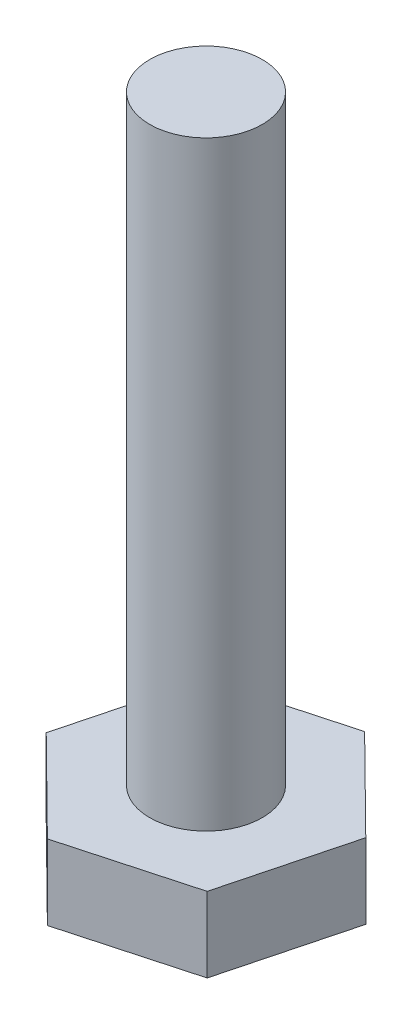
ISO-10303-21;
HEADER;
FILE_DESCRIPTION(('STEP AP214'),'2;1');
FILE_NAME('part.step','',(''),(''),'','','');
FILE_SCHEMA(('AUTOMOTIVE_DESIGN { 1 0 10303 214 1 1 1 1 }'));
ENDSEC;
DATA;
#1=APPLICATION_CONTEXT('core data for automotive mechanical design processes');
#2=APPLICATION_PROTOCOL_DEFINITION('international standard','automotive_design',2000,#1);
#3=PRODUCT_CONTEXT('',#1,'mechanical');
#4=PRODUCT('Part','Part','',(#3));
#5=PRODUCT_RELATED_PRODUCT_CATEGORY('part','',(#4));
#6=PRODUCT_DEFINITION_FORMATION('','',#4);
#7=PRODUCT_DEFINITION_CONTEXT('part definition',#1,'design');
#8=PRODUCT_DEFINITION('design','',#6,#7);
#9=PRODUCT_DEFINITION_SHAPE('','',#8);
#10=(LENGTH_UNIT() NAMED_UNIT(*) SI_UNIT(.MILLI.,.METRE.));
#11=(NAMED_UNIT(*) PLANE_ANGLE_UNIT() SI_UNIT($,.RADIAN.));
#12=(NAMED_UNIT(*) SI_UNIT($,.STERADIAN.) SOLID_ANGLE_UNIT());
#13=UNCERTAINTY_MEASURE_WITH_UNIT(LENGTH_MEASURE(1.E-05),#10,'distance_accuracy_value','');
#14=(GEOMETRIC_REPRESENTATION_CONTEXT(3) GLOBAL_UNCERTAINTY_ASSIGNED_CONTEXT((#13)) GLOBAL_UNIT_ASSIGNED_CONTEXT((#10,
#11,#12)) REPRESENTATION_CONTEXT('',''));
#15=CARTESIAN_POINT('',(0.,0.,0.));
#16=DIRECTION('',(0.,0.,1.));
#17=DIRECTION('',(1.,0.,0.));
#18=AXIS2_PLACEMENT_3D('',#15,#16,#17);
#19=CARTESIAN_POINT('',(-0.875028005436949,2.,3.35176460833709));
#20=DIRECTION('',(-0.265028548361683,0.,-0.964240565706141));
#21=DIRECTION('',(-0.964240565706141,0.,0.265028548361683));
#22=AXIS2_PLACEMENT_3D('',#19,#20,#21);
#23=PLANE('',#22);
#24=DIRECTION('',(0.964240565706141,0.,-0.265028548361683));
#25=VECTOR('',#24,1.);
#26=CARTESIAN_POINT('',(-0.875028005436949,0.,3.35176460833709));
#27=LINE('',#26,#25);
#28=CARTESIAN_POINT('',(-0.875028005436949,0.,3.35176460833709));
#29=VERTEX_POINT('',#28);
#30=CARTESIAN_POINT('',(2.46519929560704,0.,2.43367878589977));
#31=VERTEX_POINT('',#30);
#32=EDGE_CURVE('E117',#29,#31,#27,.T.);
#33=ORIENTED_EDGE('',*,*,#32,.T.);
#34=DIRECTION('',(0.,-1.,0.));
#35=VECTOR('',#34,1.);
#36=CARTESIAN_POINT('',(2.46519929560704,2.,2.43367878589977));
#37=LINE('',#36,#35);
#38=CARTESIAN_POINT('',(2.46519929560704,2.,2.43367878589977));
#39=VERTEX_POINT('',#38);
#40=EDGE_CURVE('E11',#39,#31,#37,.T.);
#41=ORIENTED_EDGE('',*,*,#40,.F.);
#42=DIRECTION('',(0.964240565706141,0.,-0.265028548361683));
#43=VECTOR('',#42,1.);
#44=CARTESIAN_POINT('',(-0.875028005436949,2.,3.35176460833709));
#45=LINE('',#44,#43);
#46=CARTESIAN_POINT('',(-0.875028005436949,2.,3.35176460833709));
#47=VERTEX_POINT('',#46);
#48=EDGE_CURVE('E128',#47,#39,#45,.T.);
#49=ORIENTED_EDGE('',*,*,#48,.F.);
#50=DIRECTION('',(0.,-1.,0.));
#51=VECTOR('',#50,1.);
#52=CARTESIAN_POINT('',(-0.875028005436949,2.,3.35176460833709));
#53=LINE('',#52,#51);
#54=EDGE_CURVE('E113',#47,#29,#53,.T.);
#55=ORIENTED_EDGE('',*,*,#54,.T.);
#56=EDGE_LOOP('',(#33,#41,#49,#55));
#57=FACE_BOUND('',#56,.T.);
#58=ADVANCED_FACE('F33',(#57),#23,.F.);
#59=CARTESIAN_POINT('',(2.46519929560704,2.,2.43367878589977));
#60=DIRECTION('',(-0.967571099441838,0.,-0.252598827243741));
#61=DIRECTION('',(-0.252598827243742,0.,0.967571099441838));
#62=AXIS2_PLACEMENT_3D('',#59,#60,#61);
#63=PLANE('',#62);
#64=DIRECTION('',(0.252598827243741,0.,-0.967571099441838));
#65=VECTOR('',#64,1.);
#66=CARTESIAN_POINT('',(2.46519929560704,0.,2.43367878589977));
#67=LINE('',#66,#65);
#68=CARTESIAN_POINT('',(3.34022730104399,0.,-0.918085822437318));
#69=VERTEX_POINT('',#68);
#70=EDGE_CURVE('E120',#31,#69,#67,.T.);
#71=ORIENTED_EDGE('',*,*,#70,.T.);
#72=DIRECTION('',(0.,-1.,0.));
#73=VECTOR('',#72,1.);
#74=CARTESIAN_POINT('',(3.34022730104399,2.,-0.918085822437318));
#75=LINE('',#74,#73);
#76=CARTESIAN_POINT('',(3.34022730104399,2.,-0.918085822437318));
#77=VERTEX_POINT('',#76);
#78=EDGE_CURVE('E41',#77,#69,#75,.T.);
#79=ORIENTED_EDGE('',*,*,#78,.F.);
#80=DIRECTION('',(0.252598827243741,0.,-0.967571099441838));
#81=VECTOR('',#80,1.);
#82=CARTESIAN_POINT('',(2.46519929560704,2.,2.43367878589977));
#83=LINE('',#82,#81);
#84=EDGE_CURVE('E86',#39,#77,#83,.T.);
#85=ORIENTED_EDGE('',*,*,#84,.F.);
#86=ORIENTED_EDGE('',*,*,#40,.T.);
#87=EDGE_LOOP('',(#71,#79,#85,#86));
#88=FACE_BOUND('',#87,.T.);
#89=ADVANCED_FACE('F153',(#88),#63,.F.);
#90=CARTESIAN_POINT('',(3.34022730104399,2.,-0.918085822437318));
#91=DIRECTION('',(-0.702542551080157,0.,0.711641738462399));
#92=DIRECTION('',(0.711641738462399,0.,0.702542551080157));
#93=AXIS2_PLACEMENT_3D('',#90,#91,#92);
#94=PLANE('',#93);
#95=DIRECTION('',(-0.711641738462399,0.,-0.702542551080157));
#96=VECTOR('',#95,1.);
#97=CARTESIAN_POINT('',(3.34022730104399,0.,-0.918085822437318));
#98=LINE('',#97,#96);
#99=CARTESIAN_POINT('',(0.875028005436953,0.,-3.35176460833709));
#100=VERTEX_POINT('',#99);
#101=EDGE_CURVE('E123',#69,#100,#98,.T.);
#102=ORIENTED_EDGE('',*,*,#101,.T.);
#103=DIRECTION('',(0.,-1.,0.));
#104=VECTOR('',#103,1.);
#105=CARTESIAN_POINT('',(0.875028005436953,2.,-3.35176460833709));
#106=LINE('',#105,#104);
#107=CARTESIAN_POINT('',(0.875028005436953,2.,-3.35176460833709));
#108=VERTEX_POINT('',#107);
#109=EDGE_CURVE('E108',#108,#100,#106,.T.);
#110=ORIENTED_EDGE('',*,*,#109,.F.);
#111=DIRECTION('',(-0.711641738462399,0.,-0.702542551080157));
#112=VECTOR('',#111,1.);
#113=CARTESIAN_POINT('',(3.34022730104399,2.,-0.918085822437318));
#114=LINE('',#113,#112);
#115=EDGE_CURVE('E99',#77,#108,#114,.T.);
#116=ORIENTED_EDGE('',*,*,#115,.F.);
#117=ORIENTED_EDGE('',*,*,#78,.T.);
#118=EDGE_LOOP('',(#102,#110,#116,#117));
#119=FACE_BOUND('',#118,.T.);
#120=ADVANCED_FACE('F134',(#119),#94,.F.);
#121=CARTESIAN_POINT('',(0.875028005436953,2.,-3.35176460833709));
#122=DIRECTION('',(0.265028548361682,0.,0.964240565706141));
#123=DIRECTION('',(0.964240565706141,0.,-0.265028548361682));
#124=AXIS2_PLACEMENT_3D('',#121,#122,#123);
#125=PLANE('',#124);
#126=DIRECTION('',(-0.964240565706141,0.,0.265028548361682));
#127=VECTOR('',#126,1.);
#128=CARTESIAN_POINT('',(0.875028005436953,0.,-3.35176460833709));
#129=LINE('',#128,#127);
#130=CARTESIAN_POINT('',(-2.46519929560704,0.,-2.43367878589978));
#131=VERTEX_POINT('',#130);
#132=EDGE_CURVE('E107',#100,#131,#129,.T.);
#133=ORIENTED_EDGE('',*,*,#132,.T.);
#134=DIRECTION('',(0.,-1.,0.));
#135=VECTOR('',#134,1.);
#136=CARTESIAN_POINT('',(-2.46519929560704,2.,-2.43367878589978));
#137=LINE('',#136,#135);
#138=CARTESIAN_POINT('',(-2.46519929560704,2.,-2.43367878589978));
#139=VERTEX_POINT('',#138);
#140=EDGE_CURVE('E104',#139,#131,#137,.T.);
#141=ORIENTED_EDGE('',*,*,#140,.F.);
#142=DIRECTION('',(-0.964240565706141,0.,0.265028548361682));
#143=VECTOR('',#142,1.);
#144=CARTESIAN_POINT('',(0.875028005436953,2.,-3.35176460833709));
#145=LINE('',#144,#143);
#146=EDGE_CURVE('E93',#108,#139,#145,.T.);
#147=ORIENTED_EDGE('',*,*,#146,.F.);
#148=ORIENTED_EDGE('',*,*,#109,.T.);
#149=EDGE_LOOP('',(#133,#141,#147,#148));
#150=FACE_BOUND('',#149,.T.);
#151=ADVANCED_FACE('F105',(#150),#125,.F.);
#152=CARTESIAN_POINT('',(-2.46519929560704,2.,-2.43367878589978));
#153=DIRECTION('',(0.967571099441838,0.,0.252598827243741));
#154=DIRECTION('',(0.252598827243742,0.,-0.967571099441838));
#155=AXIS2_PLACEMENT_3D('',#152,#153,#154);
#156=PLANE('',#155);
#157=DIRECTION('',(-0.252598827243741,0.,0.967571099441838));
#158=VECTOR('',#157,1.);
#159=CARTESIAN_POINT('',(-2.46519929560704,0.,-2.43367878589978));
#160=LINE('',#159,#158);
#161=CARTESIAN_POINT('',(-3.34022730104399,0.,0.91808582243732));
#162=VERTEX_POINT('',#161);
#163=EDGE_CURVE('E72',#131,#162,#160,.T.);
#164=ORIENTED_EDGE('',*,*,#163,.T.);
#165=DIRECTION('',(0.,-1.,0.));
#166=VECTOR('',#165,1.);
#167=CARTESIAN_POINT('',(-3.34022730104399,2.,0.91808582243732));
#168=LINE('',#167,#166);
#169=CARTESIAN_POINT('',(-3.34022730104399,2.,0.91808582243732));
#170=VERTEX_POINT('',#169);
#171=EDGE_CURVE('E109',#170,#162,#168,.T.);
#172=ORIENTED_EDGE('',*,*,#171,.F.);
#173=DIRECTION('',(-0.252598827243741,0.,0.967571099441838));
#174=VECTOR('',#173,1.);
#175=CARTESIAN_POINT('',(-2.46519929560704,2.,-2.43367878589978));
#176=LINE('',#175,#174);
#177=EDGE_CURVE('E97',#139,#170,#176,.T.);
#178=ORIENTED_EDGE('',*,*,#177,.F.);
#179=ORIENTED_EDGE('',*,*,#140,.T.);
#180=EDGE_LOOP('',(#164,#172,#178,#179));
#181=FACE_BOUND('',#180,.T.);
#182=ADVANCED_FACE('F111',(#181),#156,.F.);
#183=CARTESIAN_POINT('',(-3.34022730104399,2.,0.91808582243732));
#184=DIRECTION('',(0.702542551080156,0.,-0.7116417384624));
#185=DIRECTION('',(-0.7116417384624,0.,-0.702542551080156));
#186=AXIS2_PLACEMENT_3D('',#183,#184,#185);
#187=PLANE('',#186);
#188=DIRECTION('',(0.7116417384624,0.,0.702542551080156));
#189=VECTOR('',#188,1.);
#190=CARTESIAN_POINT('',(-3.34022730104399,0.,0.91808582243732));
#191=LINE('',#190,#189);
#192=EDGE_CURVE('E78',#162,#29,#191,.T.);
#193=ORIENTED_EDGE('',*,*,#192,.T.);
#194=ORIENTED_EDGE('',*,*,#54,.F.);
#195=DIRECTION('',(0.7116417384624,0.,0.702542551080156));
#196=VECTOR('',#195,1.);
#197=CARTESIAN_POINT('',(-3.34022730104399,2.,0.91808582243732));
#198=LINE('',#197,#196);
#199=EDGE_CURVE('E49',#170,#47,#198,.T.);
#200=ORIENTED_EDGE('',*,*,#199,.F.);
#201=ORIENTED_EDGE('',*,*,#171,.T.);
#202=EDGE_LOOP('',(#193,#194,#200,#201));
#203=FACE_BOUND('',#202,.T.);
#204=ADVANCED_FACE('F141',(#203),#187,.F.);
#205=CARTESIAN_POINT('',(0.,2.,0.));
#206=DIRECTION('',(0.,1.,0.));
#207=DIRECTION('',(0.,0.,1.));
#208=AXIS2_PLACEMENT_3D('',#205,#206,#207);
#209=PLANE('',#208);
#210=CARTESIAN_POINT('',(0.,2.,0.));
#211=DIRECTION('',(0.,1.,0.));
#212=DIRECTION('',(0.,0.,1.));
#213=AXIS2_PLACEMENT_3D('',#210,#211,#212);
#214=CIRCLE('',#213,1.5);
#215=CARTESIAN_POINT('',(0.,2.,1.5));
#216=VERTEX_POINT('',#215);
#217=EDGE_CURVE('E214',#216,#216,#214,.T.);
#218=ORIENTED_EDGE('',*,*,#217,.F.);
#219=EDGE_LOOP('',(#218));
#220=FACE_BOUND('',#219,.T.);
#221=ORIENTED_EDGE('',*,*,#48,.T.);
#222=ORIENTED_EDGE('',*,*,#84,.T.);
#223=ORIENTED_EDGE('',*,*,#115,.T.);
#224=ORIENTED_EDGE('',*,*,#146,.T.);
#225=ORIENTED_EDGE('',*,*,#177,.T.);
#226=ORIENTED_EDGE('',*,*,#199,.T.);
#227=EDGE_LOOP('',(#221,#222,#223,#224,#225,#226));
#228=FACE_BOUND('',#227,.T.);
#229=ADVANCED_FACE('F95',(#220,#228),#209,.T.);
#230=CARTESIAN_POINT('',(0.,0.,0.));
#231=DIRECTION('',(0.,1.,0.));
#232=DIRECTION('',(0.,0.,1.));
#233=AXIS2_PLACEMENT_3D('',#230,#231,#232);
#234=PLANE('',#233);
#235=ORIENTED_EDGE('',*,*,#32,.F.);
#236=ORIENTED_EDGE('',*,*,#192,.F.);
#237=ORIENTED_EDGE('',*,*,#163,.F.);
#238=ORIENTED_EDGE('',*,*,#132,.F.);
#239=ORIENTED_EDGE('',*,*,#101,.F.);
#240=ORIENTED_EDGE('',*,*,#70,.F.);
#241=EDGE_LOOP('',(#235,#236,#237,#238,#239,#240));
#242=FACE_BOUND('',#241,.T.);
#243=ADVANCED_FACE('F137',(#242),#234,.F.);
#244=CARTESIAN_POINT('',(0.,18.,0.));
#245=DIRECTION('',(0.,-1.,0.));
#246=DIRECTION('',(0.,0.,-1.));
#247=AXIS2_PLACEMENT_3D('',#244,#245,#246);
#248=CYLINDRICAL_SURFACE('',#247,1.5);
#249=CARTESIAN_POINT('',(0.,18.,0.));
#250=DIRECTION('',(0.,1.,0.));
#251=DIRECTION('',(0.,0.,1.));
#252=AXIS2_PLACEMENT_3D('',#249,#250,#251);
#253=CIRCLE('',#252,1.5);
#254=CARTESIAN_POINT('',(0.,18.,1.5));
#255=VERTEX_POINT('',#254);
#256=EDGE_CURVE('E121',#255,#255,#253,.T.);
#257=ORIENTED_EDGE('',*,*,#256,.F.);
#258=EDGE_LOOP('',(#257));
#259=FACE_BOUND('',#258,.T.);
#260=ORIENTED_EDGE('',*,*,#217,.T.);
#261=EDGE_LOOP('',(#260));
#262=FACE_BOUND('',#261,.T.);
#263=ADVANCED_FACE('F185',(#259,#262),#248,.T.);
#264=CARTESIAN_POINT('',(0.,18.,0.));
#265=DIRECTION('',(0.,1.,0.));
#266=DIRECTION('',(0.,0.,1.));
#267=AXIS2_PLACEMENT_3D('',#264,#265,#266);
#268=PLANE('',#267);
#269=ORIENTED_EDGE('',*,*,#256,.T.);
#270=EDGE_LOOP('',(#269));
#271=FACE_BOUND('',#270,.T.);
#272=ADVANCED_FACE('F198',(#271),#268,.T.);
#273=CLOSED_SHELL('',(#58,#89,#120,#151,#182,#204,#229,#243,#263,#272));
#274=MANIFOLD_SOLID_BREP('B2',#273);
#275=ADVANCED_BREP_SHAPE_REPRESENTATION('',(#18,#274),#14);
#276=SHAPE_DEFINITION_REPRESENTATION(#9,#275);
ENDSEC;
END-ISO-10303-21;
